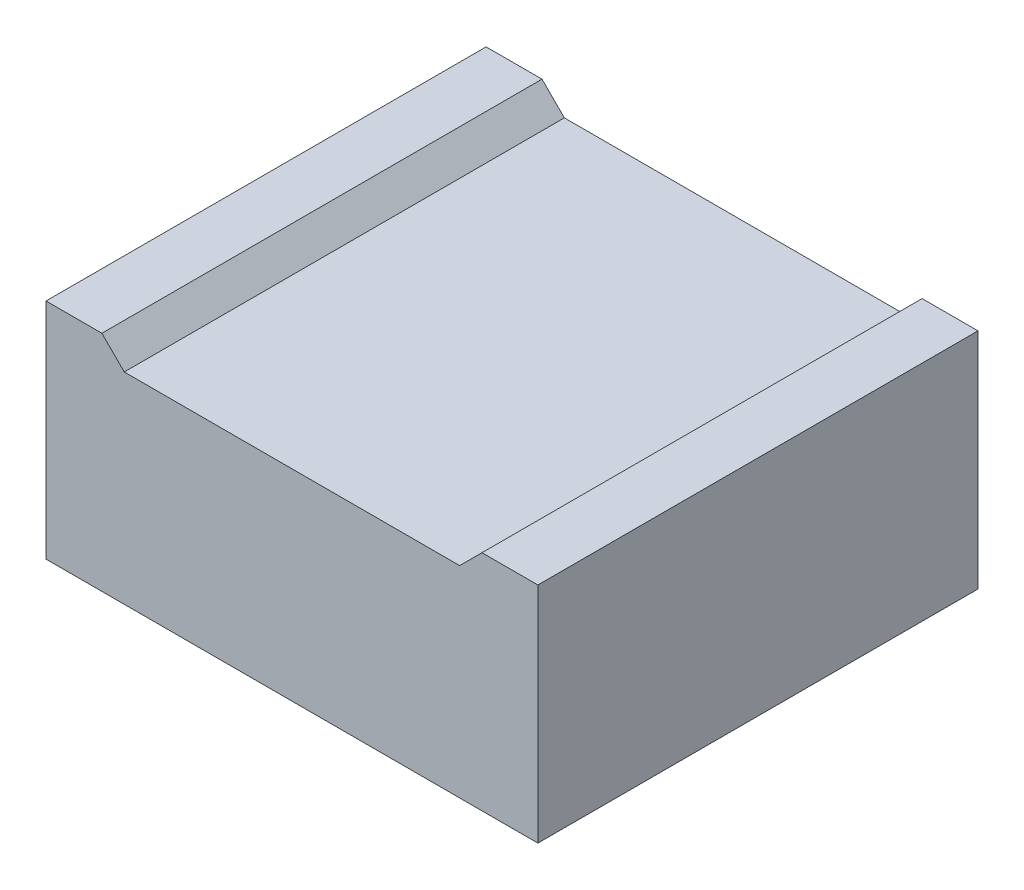
ISO-10303-21;
HEADER;
FILE_DESCRIPTION(('STEP AP214'),'2;1');
FILE_NAME('part.step','',(''),(''),'','','');
FILE_SCHEMA(('AUTOMOTIVE_DESIGN { 1 0 10303 214 1 1 1 1 }'));
ENDSEC;
DATA;
#1=APPLICATION_CONTEXT('core data for automotive mechanical design processes');
#2=APPLICATION_PROTOCOL_DEFINITION('international standard','automotive_design',2000,#1);
#3=PRODUCT_CONTEXT('',#1,'mechanical');
#4=PRODUCT('Part','Part','',(#3));
#5=PRODUCT_RELATED_PRODUCT_CATEGORY('part','',(#4));
#6=PRODUCT_DEFINITION_FORMATION('','',#4);
#7=PRODUCT_DEFINITION_CONTEXT('part definition',#1,'design');
#8=PRODUCT_DEFINITION('design','',#6,#7);
#9=PRODUCT_DEFINITION_SHAPE('','',#8);
#10=(LENGTH_UNIT() NAMED_UNIT(*) SI_UNIT(.MILLI.,.METRE.));
#11=(NAMED_UNIT(*) PLANE_ANGLE_UNIT() SI_UNIT($,.RADIAN.));
#12=(NAMED_UNIT(*) SI_UNIT($,.STERADIAN.) SOLID_ANGLE_UNIT());
#13=UNCERTAINTY_MEASURE_WITH_UNIT(LENGTH_MEASURE(1.E-05),#10,'distance_accuracy_value','');
#14=(GEOMETRIC_REPRESENTATION_CONTEXT(3) GLOBAL_UNCERTAINTY_ASSIGNED_CONTEXT((#13)) GLOBAL_UNIT_ASSIGNED_CONTEXT((#10,
#11,#12)) REPRESENTATION_CONTEXT('',''));
#15=CARTESIAN_POINT('',(0.,0.,0.));
#16=DIRECTION('',(0.,0.,1.));
#17=DIRECTION('',(1.,0.,0.));
#18=AXIS2_PLACEMENT_3D('',#15,#16,#17);
#19=CARTESIAN_POINT('',(-2.159,1.27,0.));
#20=DIRECTION('',(0.707106781186548,0.707106781186548,0.));
#21=DIRECTION('',(-0.707106781186548,0.707106781186548,0.));
#22=AXIS2_PLACEMENT_3D('',#19,#20,#21);
#23=PLANE('',#22);
#24=DIRECTION('',(0.,0.,1.));
#25=VECTOR('',#24,1.);
#26=CARTESIAN_POINT('',(-1.905,1.016,0.));
#27=LINE('',#26,#25);
#28=CARTESIAN_POINT('',(-1.905,1.016,0.));
#29=VERTEX_POINT('',#28);
#30=CARTESIAN_POINT('',(-1.905,1.016,5.));
#31=VERTEX_POINT('',#30);
#32=EDGE_CURVE('E116',#29,#31,#27,.T.);
#33=ORIENTED_EDGE('',*,*,#32,.F.);
#34=DIRECTION('',(-0.707106781186548,0.707106781186548,0.));
#35=VECTOR('',#34,1.);
#36=CARTESIAN_POINT('',(-2.159,1.27,0.));
#37=LINE('',#36,#35);
#38=CARTESIAN_POINT('',(-2.159,1.27,0.));
#39=VERTEX_POINT('',#38);
#40=EDGE_CURVE('E95',#29,#39,#37,.T.);
#41=ORIENTED_EDGE('',*,*,#40,.T.);
#42=DIRECTION('',(0.,0.,1.));
#43=VECTOR('',#42,1.);
#44=CARTESIAN_POINT('',(-2.159,1.27,0.));
#45=LINE('',#44,#43);
#46=CARTESIAN_POINT('',(-2.159,1.27,5.));
#47=VERTEX_POINT('',#46);
#48=EDGE_CURVE('E119',#47,#39,#45,.F.);
#49=ORIENTED_EDGE('',*,*,#48,.F.);
#50=DIRECTION('',(-0.707106781186548,0.707106781186548,0.));
#51=VECTOR('',#50,1.);
#52=CARTESIAN_POINT('',(-2.159,1.27,5.));
#53=LINE('',#52,#51);
#54=EDGE_CURVE('E20',#47,#31,#53,.F.);
#55=ORIENTED_EDGE('',*,*,#54,.T.);
#56=EDGE_LOOP('',(#33,#41,#49,#55));
#57=FACE_BOUND('',#56,.T.);
#58=ADVANCED_FACE('F17',(#57),#23,.T.);
#59=CARTESIAN_POINT('',(1.905,1.016,0.));
#60=DIRECTION('',(-0.707106781186548,0.707106781186548,0.));
#61=DIRECTION('',(-0.707106781186548,-0.707106781186548,0.));
#62=AXIS2_PLACEMENT_3D('',#59,#60,#61);
#63=PLANE('',#62);
#64=DIRECTION('',(0.,0.,1.));
#65=VECTOR('',#64,1.);
#66=CARTESIAN_POINT('',(2.159,1.27,0.));
#67=LINE('',#66,#65);
#68=CARTESIAN_POINT('',(2.159,1.27,0.));
#69=VERTEX_POINT('',#68);
#70=CARTESIAN_POINT('',(2.159,1.27,5.));
#71=VERTEX_POINT('',#70);
#72=EDGE_CURVE('E88',#69,#71,#67,.T.);
#73=ORIENTED_EDGE('',*,*,#72,.F.);
#74=DIRECTION('',(-0.707106781186548,-0.707106781186548,0.));
#75=VECTOR('',#74,1.);
#76=CARTESIAN_POINT('',(1.905,1.016,0.));
#77=LINE('',#76,#75);
#78=CARTESIAN_POINT('',(1.905,1.016,0.));
#79=VERTEX_POINT('',#78);
#80=EDGE_CURVE('E79',#69,#79,#77,.T.);
#81=ORIENTED_EDGE('',*,*,#80,.T.);
#82=DIRECTION('',(0.,0.,1.));
#83=VECTOR('',#82,1.);
#84=CARTESIAN_POINT('',(1.905,1.016,0.));
#85=LINE('',#84,#83);
#86=CARTESIAN_POINT('',(1.905,1.016,5.));
#87=VERTEX_POINT('',#86);
#88=EDGE_CURVE('E91',#87,#79,#85,.F.);
#89=ORIENTED_EDGE('',*,*,#88,.F.);
#90=DIRECTION('',(-0.707106781186548,-0.707106781186548,0.));
#91=VECTOR('',#90,1.);
#92=CARTESIAN_POINT('',(1.905,1.016,5.));
#93=LINE('',#92,#91);
#94=EDGE_CURVE('E84',#87,#71,#93,.F.);
#95=ORIENTED_EDGE('',*,*,#94,.T.);
#96=EDGE_LOOP('',(#73,#81,#89,#95));
#97=FACE_BOUND('',#96,.T.);
#98=ADVANCED_FACE('F86',(#97),#63,.T.);
#99=CARTESIAN_POINT('',(2.159,1.27,0.));
#100=DIRECTION('',(0.,1.,0.));
#101=DIRECTION('',(0.,0.,1.));
#102=AXIS2_PLACEMENT_3D('',#99,#100,#101);
#103=PLANE('',#102);
#104=DIRECTION('',(0.,0.,-1.));
#105=VECTOR('',#104,1.);
#106=CARTESIAN_POINT('',(2.794,1.27,0.));
#107=LINE('',#106,#105);
#108=CARTESIAN_POINT('',(2.794,1.27,0.));
#109=VERTEX_POINT('',#108);
#110=CARTESIAN_POINT('',(2.794,1.27,5.));
#111=VERTEX_POINT('',#110);
#112=EDGE_CURVE('E131',#109,#111,#107,.F.);
#113=ORIENTED_EDGE('',*,*,#112,.F.);
#114=DIRECTION('',(1.,0.,0.));
#115=VECTOR('',#114,1.);
#116=CARTESIAN_POINT('',(2.159,1.27,0.));
#117=LINE('',#116,#115);
#118=EDGE_CURVE('E105',#109,#69,#117,.F.);
#119=ORIENTED_EDGE('',*,*,#118,.T.);
#120=ORIENTED_EDGE('',*,*,#72,.T.);
#121=DIRECTION('',(1.,0.,0.));
#122=VECTOR('',#121,1.);
#123=CARTESIAN_POINT('',(2.159,1.27,5.));
#124=LINE('',#123,#122);
#125=EDGE_CURVE('E98',#71,#111,#124,.T.);
#126=ORIENTED_EDGE('',*,*,#125,.T.);
#127=EDGE_LOOP('',(#113,#119,#120,#126));
#128=FACE_BOUND('',#127,.T.);
#129=ADVANCED_FACE('F107',(#128),#103,.T.);
#130=CARTESIAN_POINT('',(-2.794,1.27,0.));
#131=DIRECTION('',(0.,1.,0.));
#132=DIRECTION('',(0.,0.,1.));
#133=AXIS2_PLACEMENT_3D('',#130,#131,#132);
#134=PLANE('',#133);
#135=ORIENTED_EDGE('',*,*,#48,.T.);
#136=DIRECTION('',(1.,0.,0.));
#137=VECTOR('',#136,1.);
#138=CARTESIAN_POINT('',(-2.794,1.27,0.));
#139=LINE('',#138,#137);
#140=CARTESIAN_POINT('',(-2.794,1.27,0.));
#141=VERTEX_POINT('',#140);
#142=EDGE_CURVE('E125',#39,#141,#139,.F.);
#143=ORIENTED_EDGE('',*,*,#142,.T.);
#144=DIRECTION('',(0.,0.,1.));
#145=VECTOR('',#144,1.);
#146=CARTESIAN_POINT('',(-2.794,1.27,0.));
#147=LINE('',#146,#145);
#148=CARTESIAN_POINT('',(-2.794,1.27,5.));
#149=VERTEX_POINT('',#148);
#150=EDGE_CURVE('E141',#149,#141,#147,.F.);
#151=ORIENTED_EDGE('',*,*,#150,.F.);
#152=DIRECTION('',(1.,0.,0.));
#153=VECTOR('',#152,1.);
#154=CARTESIAN_POINT('',(2.794,1.27,5.));
#155=LINE('',#154,#153);
#156=EDGE_CURVE('E127',#47,#149,#155,.F.);
#157=ORIENTED_EDGE('',*,*,#156,.F.);
#158=EDGE_LOOP('',(#135,#143,#151,#157));
#159=FACE_BOUND('',#158,.T.);
#160=ADVANCED_FACE('F139',(#159),#134,.T.);
#161=CARTESIAN_POINT('',(-1.905,1.016,0.));
#162=DIRECTION('',(0.,1.,0.));
#163=DIRECTION('',(0.,0.,1.));
#164=AXIS2_PLACEMENT_3D('',#161,#162,#163);
#165=PLANE('',#164);
#166=ORIENTED_EDGE('',*,*,#88,.T.);
#167=DIRECTION('',(1.,0.,0.));
#168=VECTOR('',#167,1.);
#169=CARTESIAN_POINT('',(2.794,1.016,0.));
#170=LINE('',#169,#168);
#171=EDGE_CURVE('E124',#79,#29,#170,.F.);
#172=ORIENTED_EDGE('',*,*,#171,.T.);
#173=ORIENTED_EDGE('',*,*,#32,.T.);
#174=DIRECTION('',(1.,0.,0.));
#175=VECTOR('',#174,1.);
#176=CARTESIAN_POINT('',(2.794,1.016,5.));
#177=LINE('',#176,#175);
#178=EDGE_CURVE('E123',#87,#31,#177,.F.);
#179=ORIENTED_EDGE('',*,*,#178,.F.);
#180=EDGE_LOOP('',(#166,#172,#173,#179));
#181=FACE_BOUND('',#180,.T.);
#182=ADVANCED_FACE('F122',(#181),#165,.T.);
#183=CARTESIAN_POINT('',(2.794,1.27,0.));
#184=DIRECTION('',(1.,0.,0.));
#185=DIRECTION('',(0.,0.,-1.));
#186=AXIS2_PLACEMENT_3D('',#183,#184,#185);
#187=PLANE('',#186);
#188=DIRECTION('',(0.,0.,-1.));
#189=VECTOR('',#188,1.);
#190=CARTESIAN_POINT('',(2.794,-1.27,0.));
#191=LINE('',#190,#189);
#192=CARTESIAN_POINT('',(2.794,-1.27,0.));
#193=VERTEX_POINT('',#192);
#194=CARTESIAN_POINT('',(2.794,-1.27,5.));
#195=VERTEX_POINT('',#194);
#196=EDGE_CURVE('E151',#193,#195,#191,.F.);
#197=ORIENTED_EDGE('',*,*,#196,.F.);
#198=DIRECTION('',(0.,1.,0.));
#199=VECTOR('',#198,1.);
#200=CARTESIAN_POINT('',(2.794,-1.27,0.));
#201=LINE('',#200,#199);
#202=EDGE_CURVE('E157',#193,#109,#201,.T.);
#203=ORIENTED_EDGE('',*,*,#202,.T.);
#204=ORIENTED_EDGE('',*,*,#112,.T.);
#205=DIRECTION('',(0.,1.,0.));
#206=VECTOR('',#205,1.);
#207=CARTESIAN_POINT('',(2.794,-1.27,5.));
#208=LINE('',#207,#206);
#209=EDGE_CURVE('E101',#195,#111,#208,.T.);
#210=ORIENTED_EDGE('',*,*,#209,.F.);
#211=EDGE_LOOP('',(#197,#203,#204,#210));
#212=FACE_BOUND('',#211,.T.);
#213=ADVANCED_FACE('F163',(#212),#187,.T.);
#214=CARTESIAN_POINT('',(2.794,-1.27,5.));
#215=DIRECTION('',(0.,0.,1.));
#216=DIRECTION('',(1.,0.,0.));
#217=AXIS2_PLACEMENT_3D('',#214,#215,#216);
#218=PLANE('',#217);
#219=DIRECTION('',(0.,1.,0.));
#220=VECTOR('',#219,1.);
#221=CARTESIAN_POINT('',(-2.794,-1.27,5.));
#222=LINE('',#221,#220);
#223=CARTESIAN_POINT('',(-2.794,-1.27,5.));
#224=VERTEX_POINT('',#223);
#225=EDGE_CURVE('E129',#224,#149,#222,.T.);
#226=ORIENTED_EDGE('',*,*,#225,.F.);
#227=DIRECTION('',(1.,0.,0.));
#228=VECTOR('',#227,1.);
#229=CARTESIAN_POINT('',(2.794,-1.27,5.));
#230=LINE('',#229,#228);
#231=EDGE_CURVE('E144',#195,#224,#230,.F.);
#232=ORIENTED_EDGE('',*,*,#231,.F.);
#233=ORIENTED_EDGE('',*,*,#209,.T.);
#234=ORIENTED_EDGE('',*,*,#125,.F.);
#235=ORIENTED_EDGE('',*,*,#94,.F.);
#236=ORIENTED_EDGE('',*,*,#178,.T.);
#237=ORIENTED_EDGE('',*,*,#54,.F.);
#238=ORIENTED_EDGE('',*,*,#156,.T.);
#239=EDGE_LOOP('',(#226,#232,#233,#234,#235,#236,#237,#238));
#240=FACE_BOUND('',#239,.T.);
#241=ADVANCED_FACE('F99',(#240),#218,.T.);
#242=CARTESIAN_POINT('',(-2.794,-1.27,0.));
#243=DIRECTION('',(-1.,0.,0.));
#244=DIRECTION('',(0.,0.,1.));
#245=AXIS2_PLACEMENT_3D('',#242,#243,#244);
#246=PLANE('',#245);
#247=ORIENTED_EDGE('',*,*,#150,.T.);
#248=DIRECTION('',(0.,1.,0.));
#249=VECTOR('',#248,1.);
#250=CARTESIAN_POINT('',(-2.794,-1.27,0.));
#251=LINE('',#250,#249);
#252=CARTESIAN_POINT('',(-2.794,-1.27,0.));
#253=VERTEX_POINT('',#252);
#254=EDGE_CURVE('E35',#141,#253,#251,.F.);
#255=ORIENTED_EDGE('',*,*,#254,.T.);
#256=DIRECTION('',(0.,0.,-1.));
#257=VECTOR('',#256,1.);
#258=CARTESIAN_POINT('',(-2.794,-1.27,0.));
#259=LINE('',#258,#257);
#260=EDGE_CURVE('E26',#224,#253,#259,.T.);
#261=ORIENTED_EDGE('',*,*,#260,.F.);
#262=ORIENTED_EDGE('',*,*,#225,.T.);
#263=EDGE_LOOP('',(#247,#255,#261,#262));
#264=FACE_BOUND('',#263,.T.);
#265=ADVANCED_FACE('F147',(#264),#246,.T.);
#266=CARTESIAN_POINT('',(2.794,-1.27,0.));
#267=DIRECTION('',(0.,0.,1.));
#268=DIRECTION('',(1.,0.,0.));
#269=AXIS2_PLACEMENT_3D('',#266,#267,#268);
#270=PLANE('',#269);
#271=ORIENTED_EDGE('',*,*,#254,.F.);
#272=ORIENTED_EDGE('',*,*,#142,.F.);
#273=ORIENTED_EDGE('',*,*,#40,.F.);
#274=ORIENTED_EDGE('',*,*,#171,.F.);
#275=ORIENTED_EDGE('',*,*,#80,.F.);
#276=ORIENTED_EDGE('',*,*,#118,.F.);
#277=ORIENTED_EDGE('',*,*,#202,.F.);
#278=DIRECTION('',(1.,0.,0.));
#279=VECTOR('',#278,1.);
#280=CARTESIAN_POINT('',(2.794,-1.27,0.));
#281=LINE('',#280,#279);
#282=EDGE_CURVE('E11',#253,#193,#281,.T.);
#283=ORIENTED_EDGE('',*,*,#282,.F.);
#284=EDGE_LOOP('',(#271,#272,#273,#274,#275,#276,#277,#283));
#285=FACE_BOUND('',#284,.T.);
#286=ADVANCED_FACE('F160',(#285),#270,.F.);
#287=CARTESIAN_POINT('',(2.794,-1.27,0.));
#288=DIRECTION('',(0.,-1.,0.));
#289=DIRECTION('',(0.,0.,-1.));
#290=AXIS2_PLACEMENT_3D('',#287,#288,#289);
#291=PLANE('',#290);
#292=ORIENTED_EDGE('',*,*,#260,.T.);
#293=ORIENTED_EDGE('',*,*,#282,.T.);
#294=ORIENTED_EDGE('',*,*,#196,.T.);
#295=ORIENTED_EDGE('',*,*,#231,.T.);
#296=EDGE_LOOP('',(#292,#293,#294,#295));
#297=FACE_BOUND('',#296,.T.);
#298=ADVANCED_FACE('F150',(#297),#291,.T.);
#299=CLOSED_SHELL('',(#58,#98,#129,#160,#182,#213,#241,#265,#286,#298));
#300=MANIFOLD_SOLID_BREP('B1',#299);
#301=ADVANCED_BREP_SHAPE_REPRESENTATION('',(#18,#300),#14);
#302=SHAPE_DEFINITION_REPRESENTATION(#9,#301);
ENDSEC;
END-ISO-10303-21;
